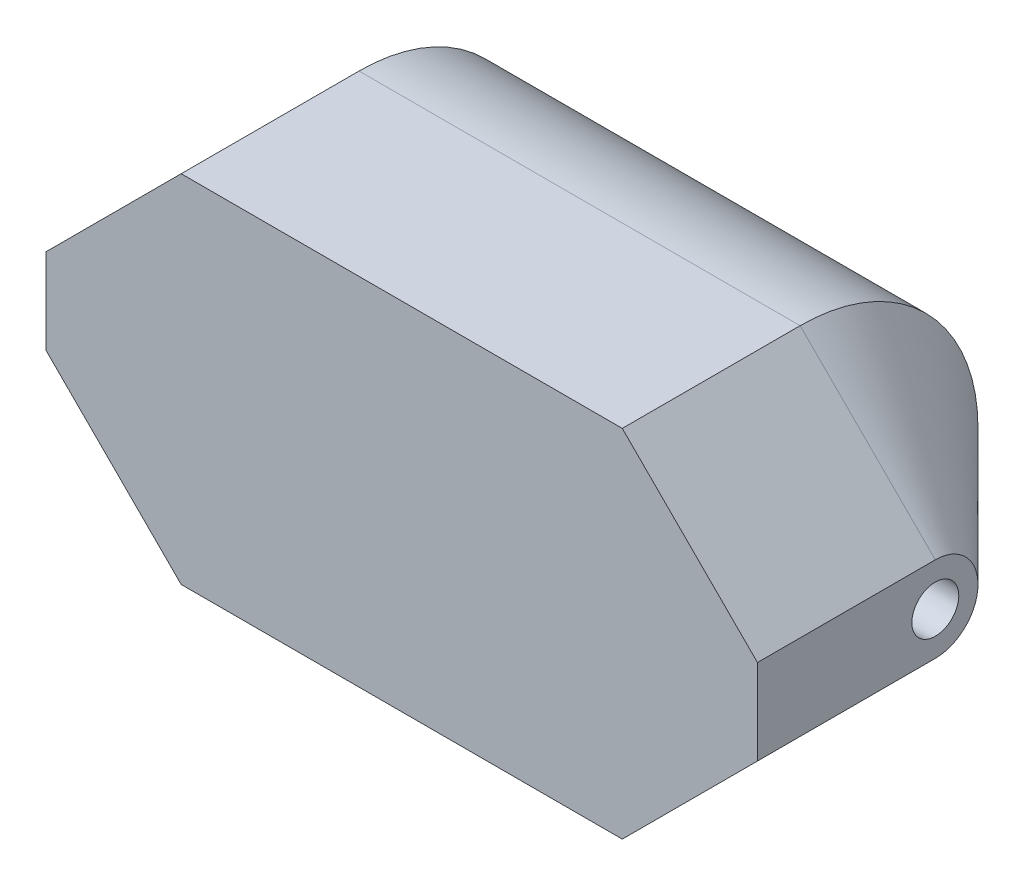
ISO-10303-21;
HEADER;
FILE_DESCRIPTION(('STEP AP214'),'2;1');
FILE_NAME('part.step','',(''),(''),'','','');
FILE_SCHEMA(('AUTOMOTIVE_DESIGN { 1 0 10303 214 1 1 1 1 }'));
ENDSEC;
DATA;
#1=APPLICATION_CONTEXT('core data for automotive mechanical design processes');
#2=APPLICATION_PROTOCOL_DEFINITION('international standard','automotive_design',2000,#1);
#3=PRODUCT_CONTEXT('',#1,'mechanical');
#4=PRODUCT('Part','Part','',(#3));
#5=PRODUCT_RELATED_PRODUCT_CATEGORY('part','',(#4));
#6=PRODUCT_DEFINITION_FORMATION('','',#4);
#7=PRODUCT_DEFINITION_CONTEXT('part definition',#1,'design');
#8=PRODUCT_DEFINITION('design','',#6,#7);
#9=PRODUCT_DEFINITION_SHAPE('','',#8);
#10=(LENGTH_UNIT() NAMED_UNIT(*) SI_UNIT(.MILLI.,.METRE.));
#11=(NAMED_UNIT(*) PLANE_ANGLE_UNIT() SI_UNIT($,.RADIAN.));
#12=(NAMED_UNIT(*) SI_UNIT($,.STERADIAN.) SOLID_ANGLE_UNIT());
#13=UNCERTAINTY_MEASURE_WITH_UNIT(LENGTH_MEASURE(1.E-05),#10,'distance_accuracy_value','');
#14=(GEOMETRIC_REPRESENTATION_CONTEXT(3) GLOBAL_UNCERTAINTY_ASSIGNED_CONTEXT((#13)) GLOBAL_UNIT_ASSIGNED_CONTEXT((#10,
#11,#12)) REPRESENTATION_CONTEXT('',''));
#15=CARTESIAN_POINT('',(0.,0.,0.));
#16=DIRECTION('',(0.,0.,1.));
#17=DIRECTION('',(1.,0.,0.));
#18=AXIS2_PLACEMENT_3D('',#15,#16,#17);
#19=CARTESIAN_POINT('',(50.,0.,0.));
#20=DIRECTION('',(1.,0.,0.));
#21=DIRECTION('',(0.,0.,-1.));
#22=AXIS2_PLACEMENT_3D('',#19,#20,#21);
#23=PLANE('',#22);
#24=DIRECTION('',(0.,-1.,0.));
#25=VECTOR('',#24,1.);
#26=CARTESIAN_POINT('',(50.,12.5,12.5));
#27=LINE('',#26,#25);
#28=CARTESIAN_POINT('',(50.,2.99999999999999,12.5));
#29=VERTEX_POINT('',#28);
#30=CARTESIAN_POINT('',(50.,-2.99999999999998,12.5));
#31=VERTEX_POINT('',#30);
#32=EDGE_CURVE('E178',#29,#31,#27,.T.);
#33=ORIENTED_EDGE('',*,*,#32,.T.);
#34=DIRECTION('',(0.,0.,-1.));
#35=VECTOR('',#34,1.);
#36=CARTESIAN_POINT('',(50.,-2.99999999999999,0.));
#37=LINE('',#36,#35);
#38=CARTESIAN_POINT('',(50.,-2.99999999999999,0.));
#39=VERTEX_POINT('',#38);
#40=EDGE_CURVE('E12',#31,#39,#37,.T.);
#41=ORIENTED_EDGE('',*,*,#40,.T.);
#42=CARTESIAN_POINT('',(50.,0.,0.));
#43=DIRECTION('',(1.,0.,0.));
#44=DIRECTION('',(0.,0.,-1.));
#45=AXIS2_PLACEMENT_3D('',#42,#43,#44);
#46=CIRCLE('',#45,2.99999999999999);
#47=CARTESIAN_POINT('',(50.,2.99999999999999,0.));
#48=VERTEX_POINT('',#47);
#49=EDGE_CURVE('E66',#39,#48,#46,.T.);
#50=ORIENTED_EDGE('',*,*,#49,.T.);
#51=DIRECTION('',(0.,0.,1.));
#52=VECTOR('',#51,1.);
#53=CARTESIAN_POINT('',(50.,2.99999999999999,12.5));
#54=LINE('',#53,#52);
#55=EDGE_CURVE('E59',#48,#29,#54,.T.);
#56=ORIENTED_EDGE('',*,*,#55,.T.);
#57=EDGE_LOOP('',(#33,#41,#50,#56));
#58=FACE_BOUND('',#57,.T.);
#59=CARTESIAN_POINT('',(50.,0.,0.));
#60=DIRECTION('',(1.,0.,0.));
#61=DIRECTION('',(0.,0.,-1.));
#62=AXIS2_PLACEMENT_3D('',#59,#60,#61);
#63=CIRCLE('',#62,1.65);
#64=CARTESIAN_POINT('',(50.,0.,-1.65));
#65=VERTEX_POINT('',#64);
#66=EDGE_CURVE('E182',#65,#65,#63,.T.);
#67=ORIENTED_EDGE('',*,*,#66,.F.);
#68=EDGE_LOOP('',(#67));
#69=FACE_BOUND('',#68,.T.);
#70=ADVANCED_FACE('F50',(#58,#69),#23,.T.);
#71=CARTESIAN_POINT('',(0.,0.,0.));
#72=DIRECTION('',(1.,0.,0.));
#73=DIRECTION('',(0.,0.,-1.));
#74=AXIS2_PLACEMENT_3D('',#71,#72,#73);
#75=PLANE('',#74);
#76=CARTESIAN_POINT('',(0.,0.,0.));
#77=DIRECTION('',(1.,0.,0.));
#78=DIRECTION('',(0.,0.,-1.));
#79=AXIS2_PLACEMENT_3D('',#76,#77,#78);
#80=CIRCLE('',#79,2.99999999999996);
#81=CARTESIAN_POINT('',(0.,2.99999999999996,0.));
#82=VERTEX_POINT('',#81);
#83=CARTESIAN_POINT('',(0.,-2.99999999999996,0.));
#84=VERTEX_POINT('',#83);
#85=EDGE_CURVE('E169',#82,#84,#80,.F.);
#86=ORIENTED_EDGE('',*,*,#85,.T.);
#87=DIRECTION('',(0.,0.,1.));
#88=VECTOR('',#87,1.);
#89=CARTESIAN_POINT('',(0.,-2.99999999999996,0.));
#90=LINE('',#89,#88);
#91=CARTESIAN_POINT('',(0.,-2.99999999999996,12.5));
#92=VERTEX_POINT('',#91);
#93=EDGE_CURVE('E165',#84,#92,#90,.T.);
#94=ORIENTED_EDGE('',*,*,#93,.T.);
#95=DIRECTION('',(0.,-1.,0.));
#96=VECTOR('',#95,1.);
#97=CARTESIAN_POINT('',(0.,12.5,12.5));
#98=LINE('',#97,#96);
#99=CARTESIAN_POINT('',(0.,2.99999999999996,12.5));
#100=VERTEX_POINT('',#99);
#101=EDGE_CURVE('E179',#100,#92,#98,.T.);
#102=ORIENTED_EDGE('',*,*,#101,.F.);
#103=DIRECTION('',(0.,0.,-1.));
#104=VECTOR('',#103,1.);
#105=CARTESIAN_POINT('',(0.,2.99999999999996,0.));
#106=LINE('',#105,#104);
#107=EDGE_CURVE('E167',#100,#82,#106,.T.);
#108=ORIENTED_EDGE('',*,*,#107,.T.);
#109=EDGE_LOOP('',(#86,#94,#102,#108));
#110=FACE_BOUND('',#109,.T.);
#111=CARTESIAN_POINT('',(0.,0.,0.));
#112=DIRECTION('',(1.,0.,0.));
#113=DIRECTION('',(0.,0.,-1.));
#114=AXIS2_PLACEMENT_3D('',#111,#112,#113);
#115=CIRCLE('',#114,1.65);
#116=CARTESIAN_POINT('',(0.,0.,-1.65));
#117=VERTEX_POINT('',#116);
#118=EDGE_CURVE('E150',#117,#117,#115,.T.);
#119=ORIENTED_EDGE('',*,*,#118,.T.);
#120=EDGE_LOOP('',(#119));
#121=FACE_BOUND('',#120,.T.);
#122=ADVANCED_FACE('F194',(#110,#121),#75,.F.);
#123=CARTESIAN_POINT('',(50.,-12.5,12.5));
#124=DIRECTION('',(0.,1.,0.));
#125=DIRECTION('',(0.,0.,1.));
#126=AXIS2_PLACEMENT_3D('',#123,#124,#125);
#127=PLANE('',#126);
#128=DIRECTION('',(-1.,0.,0.));
#129=VECTOR('',#128,1.);
#130=CARTESIAN_POINT('',(50.,-12.5,12.5));
#131=LINE('',#130,#129);
#132=CARTESIAN_POINT('',(40.4999999999999,-12.5,12.5));
#133=VERTEX_POINT('',#132);
#134=CARTESIAN_POINT('',(9.50000000000002,-12.5,12.5));
#135=VERTEX_POINT('',#134);
#136=EDGE_CURVE('E176',#133,#135,#131,.T.);
#137=ORIENTED_EDGE('',*,*,#136,.T.);
#138=DIRECTION('',(0.,0.,-1.));
#139=VECTOR('',#138,1.);
#140=CARTESIAN_POINT('',(9.50000000000001,-12.5,12.5));
#141=LINE('',#140,#139);
#142=CARTESIAN_POINT('',(9.50000000000001,-12.5,0.));
#143=VERTEX_POINT('',#142);
#144=EDGE_CURVE('E138',#135,#143,#141,.T.);
#145=ORIENTED_EDGE('',*,*,#144,.T.);
#146=DIRECTION('',(-1.,0.,0.));
#147=VECTOR('',#146,1.);
#148=CARTESIAN_POINT('',(50.,-12.5,0.));
#149=LINE('',#148,#147);
#150=CARTESIAN_POINT('',(40.4999999999999,-12.5,0.));
#151=VERTEX_POINT('',#150);
#152=EDGE_CURVE('E122',#151,#143,#149,.T.);
#153=ORIENTED_EDGE('',*,*,#152,.F.);
#154=DIRECTION('',(0.,0.,1.));
#155=VECTOR('',#154,1.);
#156=CARTESIAN_POINT('',(40.4999999999999,-12.5,12.5));
#157=LINE('',#156,#155);
#158=EDGE_CURVE('E135',#151,#133,#157,.T.);
#159=ORIENTED_EDGE('',*,*,#158,.T.);
#160=EDGE_LOOP('',(#137,#145,#153,#159));
#161=FACE_BOUND('',#160,.T.);
#162=ADVANCED_FACE('F134',(#161),#127,.F.);
#163=CARTESIAN_POINT('',(50.,0.,0.));
#164=DIRECTION('',(-1.,0.,0.));
#165=DIRECTION('',(0.,0.,1.));
#166=AXIS2_PLACEMENT_3D('',#163,#164,#165);
#167=CYLINDRICAL_SURFACE('',#166,12.5);
#168=ORIENTED_EDGE('',*,*,#152,.T.);
#169=CARTESIAN_POINT('',(9.50000000000001,0.,0.));
#170=DIRECTION('',(1.,0.,0.));
#171=DIRECTION('',(0.,0.,-1.));
#172=AXIS2_PLACEMENT_3D('',#169,#170,#171);
#173=CIRCLE('',#172,12.5);
#174=CARTESIAN_POINT('',(9.50000000000001,12.5,0.));
#175=VERTEX_POINT('',#174);
#176=EDGE_CURVE('E128',#143,#175,#173,.T.);
#177=ORIENTED_EDGE('',*,*,#176,.T.);
#178=DIRECTION('',(-1.,0.,0.));
#179=VECTOR('',#178,1.);
#180=CARTESIAN_POINT('',(50.,12.5,0.));
#181=LINE('',#180,#179);
#182=CARTESIAN_POINT('',(40.4999999999999,12.5,0.));
#183=VERTEX_POINT('',#182);
#184=EDGE_CURVE('E124',#183,#175,#181,.T.);
#185=ORIENTED_EDGE('',*,*,#184,.F.);
#186=CARTESIAN_POINT('',(40.4999999999999,0.,0.));
#187=DIRECTION('',(1.,0.,0.));
#188=DIRECTION('',(0.,0.,-1.));
#189=AXIS2_PLACEMENT_3D('',#186,#187,#188);
#190=CIRCLE('',#189,12.5);
#191=EDGE_CURVE('E119',#183,#151,#190,.F.);
#192=ORIENTED_EDGE('',*,*,#191,.T.);
#193=EDGE_LOOP('',(#168,#177,#185,#192));
#194=FACE_BOUND('',#193,.T.);
#195=ADVANCED_FACE('F121',(#194),#167,.T.);
#196=CARTESIAN_POINT('',(50.,12.5,0.));
#197=DIRECTION('',(0.,-1.,0.));
#198=DIRECTION('',(0.,0.,-1.));
#199=AXIS2_PLACEMENT_3D('',#196,#197,#198);
#200=PLANE('',#199);
#201=ORIENTED_EDGE('',*,*,#184,.T.);
#202=DIRECTION('',(0.,0.,1.));
#203=VECTOR('',#202,1.);
#204=CARTESIAN_POINT('',(9.50000000000001,12.5,0.));
#205=LINE('',#204,#203);
#206=CARTESIAN_POINT('',(9.50000000000002,12.5,12.5));
#207=VERTEX_POINT('',#206);
#208=EDGE_CURVE('E129',#175,#207,#205,.T.);
#209=ORIENTED_EDGE('',*,*,#208,.T.);
#210=DIRECTION('',(-1.,0.,0.));
#211=VECTOR('',#210,1.);
#212=CARTESIAN_POINT('',(50.,12.5,12.5));
#213=LINE('',#212,#211);
#214=CARTESIAN_POINT('',(40.4999999999999,12.5,12.5));
#215=VERTEX_POINT('',#214);
#216=EDGE_CURVE('E173',#215,#207,#213,.T.);
#217=ORIENTED_EDGE('',*,*,#216,.F.);
#218=DIRECTION('',(0.,0.,-1.));
#219=VECTOR('',#218,1.);
#220=CARTESIAN_POINT('',(40.4999999999999,12.5,0.));
#221=LINE('',#220,#219);
#222=EDGE_CURVE('E156',#215,#183,#221,.T.);
#223=ORIENTED_EDGE('',*,*,#222,.T.);
#224=EDGE_LOOP('',(#201,#209,#217,#223));
#225=FACE_BOUND('',#224,.T.);
#226=ADVANCED_FACE('F206',(#225),#200,.F.);
#227=CARTESIAN_POINT('',(50.,12.5,12.5));
#228=DIRECTION('',(0.,0.,-1.));
#229=DIRECTION('',(-1.,0.,0.));
#230=AXIS2_PLACEMENT_3D('',#227,#228,#229);
#231=PLANE('',#230);
#232=ORIENTED_EDGE('',*,*,#101,.T.);
#233=DIRECTION('',(-0.707106781186546,0.707106781186549,0.));
#234=VECTOR('',#233,1.);
#235=CARTESIAN_POINT('',(9.50000000000001,-12.5,12.5));
#236=LINE('',#235,#234);
#237=EDGE_CURVE('E158',#92,#135,#236,.F.);
#238=ORIENTED_EDGE('',*,*,#237,.T.);
#239=ORIENTED_EDGE('',*,*,#136,.F.);
#240=DIRECTION('',(0.707106781186549,0.707106781186546,0.));
#241=VECTOR('',#240,1.);
#242=CARTESIAN_POINT('',(50.,-2.99999999999999,12.5));
#243=LINE('',#242,#241);
#244=EDGE_CURVE('E142',#133,#31,#243,.T.);
#245=ORIENTED_EDGE('',*,*,#244,.T.);
#246=ORIENTED_EDGE('',*,*,#32,.F.);
#247=DIRECTION('',(-0.707106781186549,0.707106781186546,0.));
#248=VECTOR('',#247,1.);
#249=CARTESIAN_POINT('',(50.,2.99999999999999,12.5));
#250=LINE('',#249,#248);
#251=EDGE_CURVE('E163',#29,#215,#250,.T.);
#252=ORIENTED_EDGE('',*,*,#251,.T.);
#253=ORIENTED_EDGE('',*,*,#216,.T.);
#254=DIRECTION('',(0.707106781186546,0.707106781186549,0.));
#255=VECTOR('',#254,1.);
#256=CARTESIAN_POINT('',(9.50000000000001,12.5,12.5));
#257=LINE('',#256,#255);
#258=EDGE_CURVE('E160',#207,#100,#257,.F.);
#259=ORIENTED_EDGE('',*,*,#258,.T.);
#260=EDGE_LOOP('',(#232,#238,#239,#245,#246,#252,#253,#259));
#261=FACE_BOUND('',#260,.T.);
#262=ADVANCED_FACE('F203',(#261),#231,.F.);
#263=CARTESIAN_POINT('',(50.,0.,0.));
#264=DIRECTION('',(-1.,0.,0.));
#265=DIRECTION('',(0.,0.,1.));
#266=AXIS2_PLACEMENT_3D('',#263,#264,#265);
#267=CYLINDRICAL_SURFACE('',#266,1.65);
#268=ORIENTED_EDGE('',*,*,#66,.T.);
#269=EDGE_LOOP('',(#268));
#270=FACE_BOUND('',#269,.T.);
#271=ORIENTED_EDGE('',*,*,#118,.F.);
#272=EDGE_LOOP('',(#271));
#273=FACE_BOUND('',#272,.T.);
#274=ADVANCED_FACE('F190',(#270,#273),#267,.F.);
#275=CARTESIAN_POINT('',(9.50000000000001,12.5,0.));
#276=DIRECTION('',(0.707106781186549,-0.707106781186546,0.));
#277=DIRECTION('',(0.,0.,1.));
#278=AXIS2_PLACEMENT_3D('',#275,#276,#277);
#279=PLANE('',#278);
#280=ORIENTED_EDGE('',*,*,#258,.F.);
#281=ORIENTED_EDGE('',*,*,#208,.F.);
#282=DIRECTION('',(0.707106781186546,0.707106781186549,0.));
#283=VECTOR('',#282,1.);
#284=CARTESIAN_POINT('',(0.,2.99999999999996,0.));
#285=LINE('',#284,#283);
#286=EDGE_CURVE('E147',#82,#175,#285,.T.);
#287=ORIENTED_EDGE('',*,*,#286,.F.);
#288=ORIENTED_EDGE('',*,*,#107,.F.);
#289=EDGE_LOOP('',(#280,#281,#287,#288));
#290=FACE_BOUND('',#289,.T.);
#291=ADVANCED_FACE('F222',(#290),#279,.F.);
#292=CARTESIAN_POINT('',(9.50000000000001,0.,0.));
#293=DIRECTION('',(1.,0.,0.));
#294=DIRECTION('',(0.,0.,-1.));
#295=AXIS2_PLACEMENT_3D('',#292,#293,#294);
#296=CONICAL_SURFACE('',#295,12.5,0.78539816339745);
#297=ORIENTED_EDGE('',*,*,#286,.T.);
#298=ORIENTED_EDGE('',*,*,#176,.F.);
#299=DIRECTION('',(0.707106781186546,-0.707106781186549,0.));
#300=VECTOR('',#299,1.);
#301=CARTESIAN_POINT('',(0.,-2.99999999999996,0.));
#302=LINE('',#301,#300);
#303=EDGE_CURVE('E145',#84,#143,#302,.T.);
#304=ORIENTED_EDGE('',*,*,#303,.F.);
#305=ORIENTED_EDGE('',*,*,#85,.F.);
#306=EDGE_LOOP('',(#297,#298,#304,#305));
#307=FACE_BOUND('',#306,.T.);
#308=ADVANCED_FACE('F218',(#307),#296,.T.);
#309=CARTESIAN_POINT('',(9.50000000000001,-12.5,12.5));
#310=DIRECTION('',(0.707106781186549,0.707106781186546,0.));
#311=DIRECTION('',(0.,0.,-1.));
#312=AXIS2_PLACEMENT_3D('',#309,#310,#311);
#313=PLANE('',#312);
#314=ORIENTED_EDGE('',*,*,#237,.F.);
#315=ORIENTED_EDGE('',*,*,#93,.F.);
#316=ORIENTED_EDGE('',*,*,#303,.T.);
#317=ORIENTED_EDGE('',*,*,#144,.F.);
#318=EDGE_LOOP('',(#314,#315,#316,#317));
#319=FACE_BOUND('',#318,.T.);
#320=ADVANCED_FACE('F215',(#319),#313,.F.);
#321=CARTESIAN_POINT('',(50.,2.99999999999999,0.));
#322=DIRECTION('',(0.707106781186546,0.707106781186549,0.));
#323=DIRECTION('',(0.,0.,-1.));
#324=AXIS2_PLACEMENT_3D('',#321,#322,#323);
#325=PLANE('',#324);
#326=ORIENTED_EDGE('',*,*,#251,.F.);
#327=ORIENTED_EDGE('',*,*,#55,.F.);
#328=DIRECTION('',(0.707106781186549,-0.707106781186546,0.));
#329=VECTOR('',#328,1.);
#330=CARTESIAN_POINT('',(40.4999999999999,12.5,0.));
#331=LINE('',#330,#329);
#332=EDGE_CURVE('E54',#183,#48,#331,.T.);
#333=ORIENTED_EDGE('',*,*,#332,.F.);
#334=ORIENTED_EDGE('',*,*,#222,.F.);
#335=EDGE_LOOP('',(#326,#327,#333,#334));
#336=FACE_BOUND('',#335,.T.);
#337=ADVANCED_FACE('F52',(#336),#325,.T.);
#338=CARTESIAN_POINT('',(50.,0.,0.));
#339=DIRECTION('',(-1.,0.,0.));
#340=DIRECTION('',(0.,0.,1.));
#341=AXIS2_PLACEMENT_3D('',#338,#339,#340);
#342=CONICAL_SURFACE('',#341,2.99999999999999,0.785398163397446);
#343=ORIENTED_EDGE('',*,*,#332,.T.);
#344=ORIENTED_EDGE('',*,*,#49,.F.);
#345=DIRECTION('',(0.707106781186549,0.707106781186546,0.));
#346=VECTOR('',#345,1.);
#347=CARTESIAN_POINT('',(40.4999999999999,-12.5,0.));
#348=LINE('',#347,#346);
#349=EDGE_CURVE('E74',#151,#39,#348,.T.);
#350=ORIENTED_EDGE('',*,*,#349,.F.);
#351=ORIENTED_EDGE('',*,*,#191,.F.);
#352=EDGE_LOOP('',(#343,#344,#350,#351));
#353=FACE_BOUND('',#352,.T.);
#354=ADVANCED_FACE('F144',(#353),#342,.T.);
#355=CARTESIAN_POINT('',(50.,-2.99999999999999,0.));
#356=DIRECTION('',(0.707106781186546,-0.707106781186549,0.));
#357=DIRECTION('',(0.,0.,1.));
#358=AXIS2_PLACEMENT_3D('',#355,#356,#357);
#359=PLANE('',#358);
#360=ORIENTED_EDGE('',*,*,#244,.F.);
#361=ORIENTED_EDGE('',*,*,#158,.F.);
#362=ORIENTED_EDGE('',*,*,#349,.T.);
#363=ORIENTED_EDGE('',*,*,#40,.F.);
#364=EDGE_LOOP('',(#360,#361,#362,#363));
#365=FACE_BOUND('',#364,.T.);
#366=ADVANCED_FACE('F141',(#365),#359,.T.);
#367=CLOSED_SHELL('',(#70,#122,#162,#195,#226,#262,#274,#291,#308,#320,#337,#354,#366));
#368=MANIFOLD_SOLID_BREP('B2',#367);
#369=ADVANCED_BREP_SHAPE_REPRESENTATION('',(#18,#368),#14);
#370=SHAPE_DEFINITION_REPRESENTATION(#9,#369);
ENDSEC;
END-ISO-10303-21;
